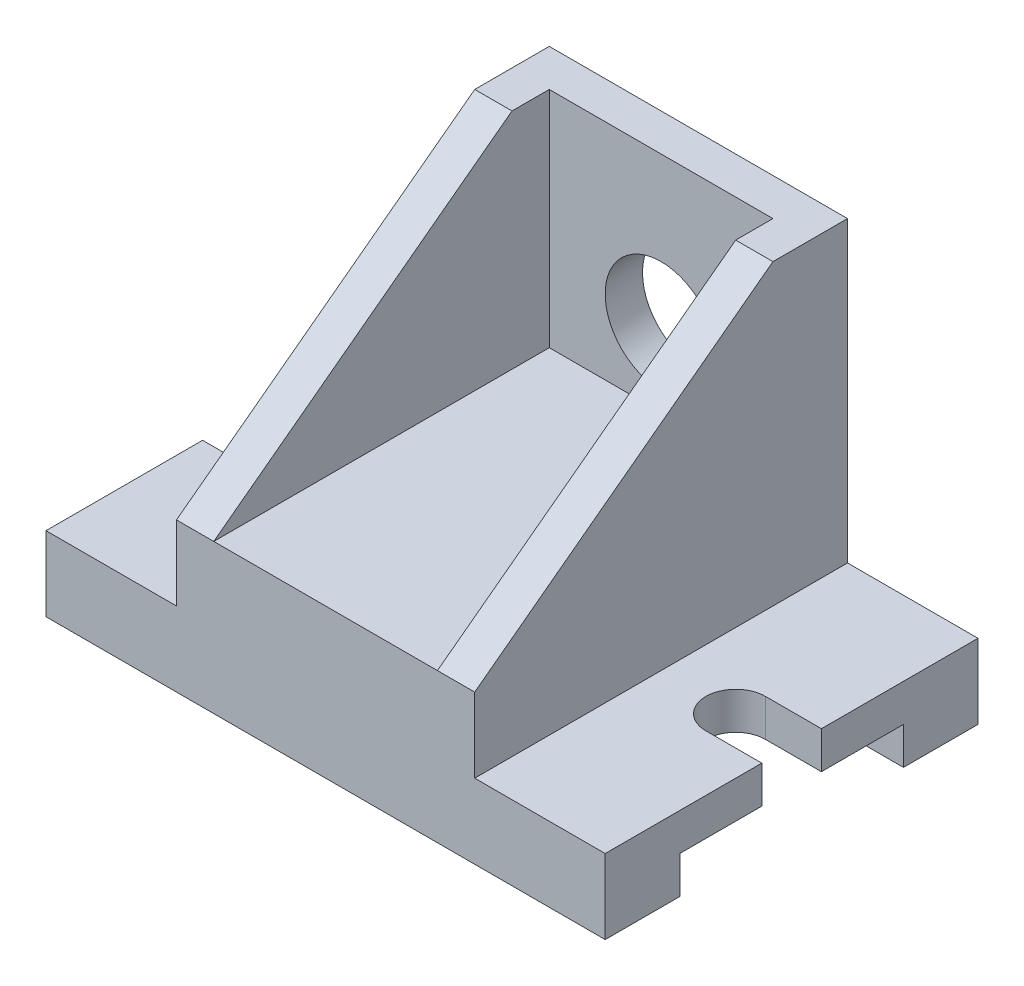
ISO-10303-21;
HEADER;
FILE_DESCRIPTION(('STEP AP214'),'2;1');
FILE_NAME('part.step','',(''),(''),'','','');
FILE_SCHEMA(('AUTOMOTIVE_DESIGN { 1 0 10303 214 1 1 1 1 }'));
ENDSEC;
DATA;
#1=APPLICATION_CONTEXT('core data for automotive mechanical design processes');
#2=APPLICATION_PROTOCOL_DEFINITION('international standard','automotive_design',2000,#1);
#3=PRODUCT_CONTEXT('',#1,'mechanical');
#4=PRODUCT('Part','Part','',(#3));
#5=PRODUCT_RELATED_PRODUCT_CATEGORY('part','',(#4));
#6=PRODUCT_DEFINITION_FORMATION('','',#4);
#7=PRODUCT_DEFINITION_CONTEXT('part definition',#1,'design');
#8=PRODUCT_DEFINITION('design','',#6,#7);
#9=PRODUCT_DEFINITION_SHAPE('','',#8);
#10=(LENGTH_UNIT() NAMED_UNIT(*) SI_UNIT(.MILLI.,.METRE.));
#11=(NAMED_UNIT(*) PLANE_ANGLE_UNIT() SI_UNIT($,.RADIAN.));
#12=(NAMED_UNIT(*) SI_UNIT($,.STERADIAN.) SOLID_ANGLE_UNIT());
#13=UNCERTAINTY_MEASURE_WITH_UNIT(LENGTH_MEASURE(1.E-05),#10,'distance_accuracy_value','');
#14=(GEOMETRIC_REPRESENTATION_CONTEXT(3) GLOBAL_UNCERTAINTY_ASSIGNED_CONTEXT((#13)) GLOBAL_UNIT_ASSIGNED_CONTEXT((#10,
#11,#12)) REPRESENTATION_CONTEXT('',''));
#15=CARTESIAN_POINT('',(0.,0.,0.));
#16=DIRECTION('',(0.,0.,1.));
#17=DIRECTION('',(1.,0.,0.));
#18=AXIS2_PLACEMENT_3D('',#15,#16,#17);
#19=CARTESIAN_POINT('',(75.,60.,-100.00005));
#20=DIRECTION('',(0.,0.,1.));
#21=DIRECTION('',(1.,0.,0.));
#22=AXIS2_PLACEMENT_3D('',#19,#20,#21);
#23=CYLINDRICAL_SURFACE('',#22,15.);
#24=CARTESIAN_POINT('',(75.,60.,-100.));
#25=DIRECTION('',(0.,0.,-1.));
#26=DIRECTION('',(-1.,0.,0.));
#27=AXIS2_PLACEMENT_3D('',#24,#25,#26);
#28=CIRCLE('',#27,15.);
#29=CARTESIAN_POINT('',(60.,60.,-100.));
#30=VERTEX_POINT('',#29);
#31=EDGE_CURVE('E234',#30,#30,#28,.T.);
#32=ORIENTED_EDGE('',*,*,#31,.T.);
#33=EDGE_LOOP('',(#32));
#34=FACE_BOUND('',#33,.T.);
#35=CARTESIAN_POINT('',(75.,60.,-90.));
#36=DIRECTION('',(0.,0.,1.));
#37=DIRECTION('',(1.,0.,0.));
#38=AXIS2_PLACEMENT_3D('',#35,#36,#37);
#39=CIRCLE('',#38,15.);
#40=CARTESIAN_POINT('',(90.,60.,-90.));
#41=VERTEX_POINT('',#40);
#42=EDGE_CURVE('E37',#41,#41,#39,.F.);
#43=ORIENTED_EDGE('',*,*,#42,.F.);
#44=EDGE_LOOP('',(#43));
#45=FACE_BOUND('',#44,.T.);
#46=ADVANCED_FACE('F33',(#34,#45),#23,.F.);
#47=CARTESIAN_POINT('',(135.,20.,-50.));
#48=DIRECTION('',(0.,1.,0.));
#49=DIRECTION('',(0.,0.,1.));
#50=AXIS2_PLACEMENT_3D('',#47,#48,#49);
#51=PLANE('',#50);
#52=DIRECTION('',(1.,0.,0.));
#53=VECTOR('',#52,1.);
#54=CARTESIAN_POINT('',(0.,20.,-100.));
#55=LINE('',#54,#53);
#56=CARTESIAN_POINT('',(115.,20.,-100.));
#57=VERTEX_POINT('',#56);
#58=CARTESIAN_POINT('',(150.,20.,-100.));
#59=VERTEX_POINT('',#58);
#60=EDGE_CURVE('E296',#57,#59,#55,.T.);
#61=ORIENTED_EDGE('',*,*,#60,.F.);
#62=DIRECTION('',(0.,0.,1.));
#63=VECTOR('',#62,1.);
#64=CARTESIAN_POINT('',(115.,20.,-100.));
#65=LINE('',#64,#63);
#66=CARTESIAN_POINT('',(115.,20.,0.));
#67=VERTEX_POINT('',#66);
#68=EDGE_CURVE('E263',#57,#67,#65,.T.);
#69=ORIENTED_EDGE('',*,*,#68,.T.);
#70=DIRECTION('',(1.,0.,0.));
#71=VECTOR('',#70,1.);
#72=CARTESIAN_POINT('',(0.,20.,0.));
#73=LINE('',#72,#71);
#74=CARTESIAN_POINT('',(150.,20.,0.));
#75=VERTEX_POINT('',#74);
#76=EDGE_CURVE('E348',#67,#75,#73,.T.);
#77=ORIENTED_EDGE('',*,*,#76,.T.);
#78=DIRECTION('',(0.,0.,-1.));
#79=VECTOR('',#78,1.);
#80=CARTESIAN_POINT('',(150.,20.,0.));
#81=LINE('',#80,#79);
#82=CARTESIAN_POINT('',(150.,20.,-42.));
#83=VERTEX_POINT('',#82);
#84=EDGE_CURVE('E362',#75,#83,#81,.T.);
#85=ORIENTED_EDGE('',*,*,#84,.T.);
#86=DIRECTION('',(-1.,0.,0.));
#87=VECTOR('',#86,1.);
#88=CARTESIAN_POINT('',(150.,20.,-42.));
#89=LINE('',#88,#87);
#90=CARTESIAN_POINT('',(135.,20.,-42.));
#91=VERTEX_POINT('',#90);
#92=EDGE_CURVE('E360',#83,#91,#89,.T.);
#93=ORIENTED_EDGE('',*,*,#92,.T.);
#94=CARTESIAN_POINT('',(135.,20.,-50.));
#95=DIRECTION('',(0.,1.,0.));
#96=DIRECTION('',(0.,0.,1.));
#97=AXIS2_PLACEMENT_3D('',#94,#95,#96);
#98=CIRCLE('',#97,8.);
#99=CARTESIAN_POINT('',(135.,20.,-58.));
#100=VERTEX_POINT('',#99);
#101=EDGE_CURVE('E357',#100,#91,#98,.T.);
#102=ORIENTED_EDGE('',*,*,#101,.F.);
#103=DIRECTION('',(1.,0.,0.));
#104=VECTOR('',#103,1.);
#105=CARTESIAN_POINT('',(135.,20.,-58.));
#106=LINE('',#105,#104);
#107=CARTESIAN_POINT('',(150.,20.,-58.));
#108=VERTEX_POINT('',#107);
#109=EDGE_CURVE('E344',#100,#108,#106,.T.);
#110=ORIENTED_EDGE('',*,*,#109,.T.);
#111=DIRECTION('',(0.,0.,-1.));
#112=VECTOR('',#111,1.);
#113=CARTESIAN_POINT('',(150.,20.,-58.));
#114=LINE('',#113,#112);
#115=EDGE_CURVE('E342',#108,#59,#114,.T.);
#116=ORIENTED_EDGE('',*,*,#115,.T.);
#117=EDGE_LOOP('',(#61,#69,#77,#85,#93,#102,#110,#116));
#118=FACE_BOUND('',#117,.T.);
#119=ADVANCED_FACE('F473',(#118),#51,.T.);
#120=CARTESIAN_POINT('',(135.,0.,-50.));
#121=DIRECTION('',(0.,1.,0.));
#122=DIRECTION('',(0.,0.,1.));
#123=AXIS2_PLACEMENT_3D('',#120,#121,#122);
#124=PLANE('',#123);
#125=DIRECTION('',(0.,0.,-1.));
#126=VECTOR('',#125,1.);
#127=CARTESIAN_POINT('',(0.,0.,0.));
#128=LINE('',#127,#126);
#129=CARTESIAN_POINT('',(0.,0.,0.));
#130=VERTEX_POINT('',#129);
#131=CARTESIAN_POINT('',(0.,0.,-20.));
#132=VERTEX_POINT('',#131);
#133=EDGE_CURVE('E402',#130,#132,#128,.T.);
#134=ORIENTED_EDGE('',*,*,#133,.T.);
#135=DIRECTION('',(1.,0.,0.));
#136=VECTOR('',#135,1.);
#137=CARTESIAN_POINT('',(0.,0.,-20.));
#138=LINE('',#137,#136);
#139=CARTESIAN_POINT('',(150.,0.,-20.));
#140=VERTEX_POINT('',#139);
#141=EDGE_CURVE('E459',#132,#140,#138,.T.);
#142=ORIENTED_EDGE('',*,*,#141,.T.);
#143=DIRECTION('',(0.,0.,-1.));
#144=VECTOR('',#143,1.);
#145=CARTESIAN_POINT('',(150.,0.,0.));
#146=LINE('',#145,#144);
#147=CARTESIAN_POINT('',(150.,0.,0.));
#148=VERTEX_POINT('',#147);
#149=EDGE_CURVE('E407',#148,#140,#146,.T.);
#150=ORIENTED_EDGE('',*,*,#149,.F.);
#151=DIRECTION('',(1.,0.,0.));
#152=VECTOR('',#151,1.);
#153=CARTESIAN_POINT('',(0.,0.,0.));
#154=LINE('',#153,#152);
#155=EDGE_CURVE('E405',#130,#148,#154,.T.);
#156=ORIENTED_EDGE('',*,*,#155,.F.);
#157=EDGE_LOOP('',(#134,#142,#150,#156));
#158=FACE_BOUND('',#157,.T.);
#159=ADVANCED_FACE('F470',(#158),#124,.F.);
#160=CARTESIAN_POINT('',(0.,20.,-58.));
#161=DIRECTION('',(-1.,0.,0.));
#162=DIRECTION('',(0.,0.,1.));
#163=AXIS2_PLACEMENT_3D('',#160,#161,#162);
#164=PLANE('',#163);
#165=DIRECTION('',(0.,0.,1.));
#166=VECTOR('',#165,1.);
#167=CARTESIAN_POINT('',(0.,10.,-20.));
#168=LINE('',#167,#166);
#169=CARTESIAN_POINT('',(0.,10.,-80.));
#170=VERTEX_POINT('',#169);
#171=CARTESIAN_POINT('',(0.,10.,-58.));
#172=VERTEX_POINT('',#171);
#173=EDGE_CURVE('E453',#170,#172,#168,.T.);
#174=ORIENTED_EDGE('',*,*,#173,.T.);
#175=DIRECTION('',(0.,-1.,0.));
#176=VECTOR('',#175,1.);
#177=CARTESIAN_POINT('',(0.,20.,-58.));
#178=LINE('',#177,#176);
#179=CARTESIAN_POINT('',(0.,20.,-58.));
#180=VERTEX_POINT('',#179);
#181=EDGE_CURVE('E275',#180,#172,#178,.T.);
#182=ORIENTED_EDGE('',*,*,#181,.F.);
#183=DIRECTION('',(0.,0.,-1.));
#184=VECTOR('',#183,1.);
#185=CARTESIAN_POINT('',(0.,20.,-58.));
#186=LINE('',#185,#184);
#187=CARTESIAN_POINT('',(0.,20.,-100.));
#188=VERTEX_POINT('',#187);
#189=EDGE_CURVE('E346',#180,#188,#186,.T.);
#190=ORIENTED_EDGE('',*,*,#189,.T.);
#191=DIRECTION('',(0.,-1.,0.));
#192=VECTOR('',#191,1.);
#193=CARTESIAN_POINT('',(0.,20.,-100.));
#194=LINE('',#193,#192);
#195=CARTESIAN_POINT('',(0.,0.,-100.));
#196=VERTEX_POINT('',#195);
#197=EDGE_CURVE('E341',#188,#196,#194,.T.);
#198=ORIENTED_EDGE('',*,*,#197,.T.);
#199=DIRECTION('',(0.,0.,-1.));
#200=VECTOR('',#199,1.);
#201=CARTESIAN_POINT('',(0.,0.,-58.));
#202=LINE('',#201,#200);
#203=CARTESIAN_POINT('',(0.,0.,-80.));
#204=VERTEX_POINT('',#203);
#205=EDGE_CURVE('E415',#204,#196,#202,.T.);
#206=ORIENTED_EDGE('',*,*,#205,.F.);
#207=DIRECTION('',(0.,1.,0.));
#208=VECTOR('',#207,1.);
#209=CARTESIAN_POINT('',(0.,0.,-80.));
#210=LINE('',#209,#208);
#211=EDGE_CURVE('E458',#204,#170,#210,.T.);
#212=ORIENTED_EDGE('',*,*,#211,.T.);
#213=EDGE_LOOP('',(#174,#182,#190,#198,#206,#212));
#214=FACE_BOUND('',#213,.T.);
#215=ADVANCED_FACE('F35',(#214),#164,.T.);
#216=CARTESIAN_POINT('',(15.,20.,-58.));
#217=DIRECTION('',(0.,0.,1.));
#218=DIRECTION('',(1.,0.,0.));
#219=AXIS2_PLACEMENT_3D('',#216,#217,#218);
#220=PLANE('',#219);
#221=DIRECTION('',(-1.,0.,0.));
#222=VECTOR('',#221,1.);
#223=CARTESIAN_POINT('',(15.,10.,-58.));
#224=LINE('',#223,#222);
#225=CARTESIAN_POINT('',(15.,10.,-58.));
#226=VERTEX_POINT('',#225);
#227=EDGE_CURVE('E417',#226,#172,#224,.T.);
#228=ORIENTED_EDGE('',*,*,#227,.F.);
#229=DIRECTION('',(0.,-1.,0.));
#230=VECTOR('',#229,1.);
#231=CARTESIAN_POINT('',(15.,20.,-58.));
#232=LINE('',#231,#230);
#233=CARTESIAN_POINT('',(15.,20.,-58.));
#234=VERTEX_POINT('',#233);
#235=EDGE_CURVE('E397',#234,#226,#232,.T.);
#236=ORIENTED_EDGE('',*,*,#235,.F.);
#237=DIRECTION('',(-1.,0.,0.));
#238=VECTOR('',#237,1.);
#239=CARTESIAN_POINT('',(15.,20.,-58.));
#240=LINE('',#239,#238);
#241=EDGE_CURVE('E371',#234,#180,#240,.T.);
#242=ORIENTED_EDGE('',*,*,#241,.T.);
#243=ORIENTED_EDGE('',*,*,#181,.T.);
#244=EDGE_LOOP('',(#228,#236,#242,#243));
#245=FACE_BOUND('',#244,.T.);
#246=ADVANCED_FACE('F462',(#245),#220,.T.);
#247=CARTESIAN_POINT('',(15.,20.,-50.));
#248=DIRECTION('',(0.,-1.,0.));
#249=DIRECTION('',(0.,0.,-1.));
#250=AXIS2_PLACEMENT_3D('',#247,#248,#249);
#251=CYLINDRICAL_SURFACE('',#250,8.);
#252=CARTESIAN_POINT('',(15.,10.,-50.));
#253=DIRECTION('',(0.,1.,0.));
#254=DIRECTION('',(0.,0.,1.));
#255=AXIS2_PLACEMENT_3D('',#252,#253,#254);
#256=CIRCLE('',#255,8.);
#257=CARTESIAN_POINT('',(15.,10.,-42.));
#258=VERTEX_POINT('',#257);
#259=EDGE_CURVE('E437',#258,#226,#256,.T.);
#260=ORIENTED_EDGE('',*,*,#259,.F.);
#261=DIRECTION('',(0.,-1.,0.));
#262=VECTOR('',#261,1.);
#263=CARTESIAN_POINT('',(15.,20.,-42.));
#264=LINE('',#263,#262);
#265=CARTESIAN_POINT('',(15.,20.,-42.));
#266=VERTEX_POINT('',#265);
#267=EDGE_CURVE('E394',#266,#258,#264,.T.);
#268=ORIENTED_EDGE('',*,*,#267,.F.);
#269=CARTESIAN_POINT('',(15.,20.,-50.));
#270=DIRECTION('',(0.,1.,0.));
#271=DIRECTION('',(0.,0.,1.));
#272=AXIS2_PLACEMENT_3D('',#269,#270,#271);
#273=CIRCLE('',#272,8.);
#274=EDGE_CURVE('E420',#266,#234,#273,.T.);
#275=ORIENTED_EDGE('',*,*,#274,.T.);
#276=ORIENTED_EDGE('',*,*,#235,.T.);
#277=EDGE_LOOP('',(#260,#268,#275,#276));
#278=FACE_BOUND('',#277,.T.);
#279=ADVANCED_FACE('F436',(#278),#251,.F.);
#280=CARTESIAN_POINT('',(0.,20.,-42.));
#281=DIRECTION('',(0.,0.,-1.));
#282=DIRECTION('',(-1.,0.,0.));
#283=AXIS2_PLACEMENT_3D('',#280,#281,#282);
#284=PLANE('',#283);
#285=DIRECTION('',(1.,0.,0.));
#286=VECTOR('',#285,1.);
#287=CARTESIAN_POINT('',(0.,10.,-42.));
#288=LINE('',#287,#286);
#289=CARTESIAN_POINT('',(0.,10.,-42.));
#290=VERTEX_POINT('',#289);
#291=EDGE_CURVE('E440',#290,#258,#288,.T.);
#292=ORIENTED_EDGE('',*,*,#291,.F.);
#293=DIRECTION('',(0.,-1.,0.));
#294=VECTOR('',#293,1.);
#295=CARTESIAN_POINT('',(0.,20.,-42.));
#296=LINE('',#295,#294);
#297=CARTESIAN_POINT('',(0.,20.,-42.));
#298=VERTEX_POINT('',#297);
#299=EDGE_CURVE('E391',#298,#290,#296,.T.);
#300=ORIENTED_EDGE('',*,*,#299,.F.);
#301=DIRECTION('',(1.,0.,0.));
#302=VECTOR('',#301,1.);
#303=CARTESIAN_POINT('',(0.,20.,-42.));
#304=LINE('',#303,#302);
#305=EDGE_CURVE('E422',#298,#266,#304,.T.);
#306=ORIENTED_EDGE('',*,*,#305,.T.);
#307=ORIENTED_EDGE('',*,*,#267,.T.);
#308=EDGE_LOOP('',(#292,#300,#306,#307));
#309=FACE_BOUND('',#308,.T.);
#310=ADVANCED_FACE('F439',(#309),#284,.T.);
#311=CARTESIAN_POINT('',(0.,20.,0.));
#312=DIRECTION('',(-1.,0.,0.));
#313=DIRECTION('',(0.,0.,1.));
#314=AXIS2_PLACEMENT_3D('',#311,#312,#313);
#315=PLANE('',#314);
#316=DIRECTION('',(0.,-1.,0.));
#317=VECTOR('',#316,1.);
#318=CARTESIAN_POINT('',(0.,0.,-20.));
#319=LINE('',#318,#317);
#320=CARTESIAN_POINT('',(0.,10.,-20.));
#321=VERTEX_POINT('',#320);
#322=EDGE_CURVE('E291',#321,#132,#319,.T.);
#323=ORIENTED_EDGE('',*,*,#322,.T.);
#324=ORIENTED_EDGE('',*,*,#133,.F.);
#325=DIRECTION('',(0.,-1.,0.));
#326=VECTOR('',#325,1.);
#327=CARTESIAN_POINT('',(0.,20.,0.));
#328=LINE('',#327,#326);
#329=CARTESIAN_POINT('',(0.,20.,0.));
#330=VERTEX_POINT('',#329);
#331=EDGE_CURVE('E389',#330,#130,#328,.T.);
#332=ORIENTED_EDGE('',*,*,#331,.F.);
#333=DIRECTION('',(0.,0.,-1.));
#334=VECTOR('',#333,1.);
#335=CARTESIAN_POINT('',(0.,20.,0.));
#336=LINE('',#335,#334);
#337=EDGE_CURVE('E365',#330,#298,#336,.T.);
#338=ORIENTED_EDGE('',*,*,#337,.T.);
#339=ORIENTED_EDGE('',*,*,#299,.T.);
#340=EDGE_CURVE('E460',#290,#321,#168,.T.);
#341=ORIENTED_EDGE('',*,*,#340,.T.);
#342=EDGE_LOOP('',(#323,#324,#332,#338,#339,#341));
#343=FACE_BOUND('',#342,.T.);
#344=ADVANCED_FACE('F429',(#343),#315,.T.);
#345=CARTESIAN_POINT('',(0.,20.,0.));
#346=DIRECTION('',(0.,0.,-1.));
#347=DIRECTION('',(-1.,0.,0.));
#348=AXIS2_PLACEMENT_3D('',#345,#346,#347);
#349=PLANE('',#348);
#350=DIRECTION('',(0.,-1.,0.));
#351=VECTOR('',#350,1.);
#352=CARTESIAN_POINT('',(115.,40.,0.));
#353=LINE('',#352,#351);
#354=CARTESIAN_POINT('',(115.,40.,0.));
#355=VERTEX_POINT('',#354);
#356=EDGE_CURVE('E276',#355,#67,#353,.T.);
#357=ORIENTED_EDGE('',*,*,#356,.F.);
#358=DIRECTION('',(1.,0.,0.));
#359=VECTOR('',#358,1.);
#360=CARTESIAN_POINT('',(-2.49999999868411E-05,40.,0.));
#361=LINE('',#360,#359);
#362=CARTESIAN_POINT('',(105.,40.,0.));
#363=VERTEX_POINT('',#362);
#364=EDGE_CURVE('E237',#363,#355,#361,.T.);
#365=ORIENTED_EDGE('',*,*,#364,.F.);
#366=DIRECTION('',(1.,0.,0.));
#367=VECTOR('',#366,1.);
#368=CARTESIAN_POINT('',(35.,40.,0.));
#369=LINE('',#368,#367);
#370=CARTESIAN_POINT('',(45.,40.,0.));
#371=VERTEX_POINT('',#370);
#372=EDGE_CURVE('E270',#371,#363,#369,.T.);
#373=ORIENTED_EDGE('',*,*,#372,.F.);
#374=CARTESIAN_POINT('',(35.,40.,0.));
#375=VERTEX_POINT('',#374);
#376=EDGE_CURVE('E240',#375,#371,#361,.T.);
#377=ORIENTED_EDGE('',*,*,#376,.F.);
#378=DIRECTION('',(0.,-1.,0.));
#379=VECTOR('',#378,1.);
#380=CARTESIAN_POINT('',(35.,40.,0.));
#381=LINE('',#380,#379);
#382=CARTESIAN_POINT('',(35.,20.,0.));
#383=VERTEX_POINT('',#382);
#384=EDGE_CURVE('E277',#375,#383,#381,.T.);
#385=ORIENTED_EDGE('',*,*,#384,.T.);
#386=EDGE_CURVE('E337',#330,#383,#73,.T.);
#387=ORIENTED_EDGE('',*,*,#386,.F.);
#388=ORIENTED_EDGE('',*,*,#331,.T.);
#389=ORIENTED_EDGE('',*,*,#155,.T.);
#390=DIRECTION('',(0.,-1.,0.));
#391=VECTOR('',#390,1.);
#392=CARTESIAN_POINT('',(150.,20.,0.));
#393=LINE('',#392,#391);
#394=EDGE_CURVE('E386',#75,#148,#393,.T.);
#395=ORIENTED_EDGE('',*,*,#394,.F.);
#396=ORIENTED_EDGE('',*,*,#76,.F.);
#397=EDGE_LOOP('',(#357,#365,#373,#377,#385,#387,#388,#389,#395,#396));
#398=FACE_BOUND('',#397,.T.);
#399=ADVANCED_FACE('F323',(#398),#349,.F.);
#400=CARTESIAN_POINT('',(150.,20.,0.));
#401=DIRECTION('',(-1.,0.,0.));
#402=DIRECTION('',(0.,0.,1.));
#403=AXIS2_PLACEMENT_3D('',#400,#401,#402);
#404=PLANE('',#403);
#405=ORIENTED_EDGE('',*,*,#149,.T.);
#406=DIRECTION('',(0.,-1.,0.));
#407=VECTOR('',#406,1.);
#408=CARTESIAN_POINT('',(150.,0.,-20.));
#409=LINE('',#408,#407);
#410=CARTESIAN_POINT('',(150.,10.,-20.));
#411=VERTEX_POINT('',#410);
#412=EDGE_CURVE('E304',#411,#140,#409,.T.);
#413=ORIENTED_EDGE('',*,*,#412,.F.);
#414=DIRECTION('',(0.,0.,1.));
#415=VECTOR('',#414,1.);
#416=CARTESIAN_POINT('',(150.,10.,-20.));
#417=LINE('',#416,#415);
#418=CARTESIAN_POINT('',(150.,10.,-42.));
#419=VERTEX_POINT('',#418);
#420=EDGE_CURVE('E527',#419,#411,#417,.T.);
#421=ORIENTED_EDGE('',*,*,#420,.F.);
#422=DIRECTION('',(0.,-1.,0.));
#423=VECTOR('',#422,1.);
#424=CARTESIAN_POINT('',(150.,20.,-42.));
#425=LINE('',#424,#423);
#426=EDGE_CURVE('E383',#83,#419,#425,.T.);
#427=ORIENTED_EDGE('',*,*,#426,.F.);
#428=ORIENTED_EDGE('',*,*,#84,.F.);
#429=ORIENTED_EDGE('',*,*,#394,.T.);
#430=EDGE_LOOP('',(#405,#413,#421,#427,#428,#429));
#431=FACE_BOUND('',#430,.T.);
#432=ADVANCED_FACE('F559',(#431),#404,.F.);
#433=CARTESIAN_POINT('',(150.,20.,-42.));
#434=DIRECTION('',(0.,0.,1.));
#435=DIRECTION('',(1.,0.,0.));
#436=AXIS2_PLACEMENT_3D('',#433,#434,#435);
#437=PLANE('',#436);
#438=ORIENTED_EDGE('',*,*,#426,.T.);
#439=DIRECTION('',(-1.,0.,0.));
#440=VECTOR('',#439,1.);
#441=CARTESIAN_POINT('',(150.,10.,-42.));
#442=LINE('',#441,#440);
#443=CARTESIAN_POINT('',(135.,10.,-42.));
#444=VERTEX_POINT('',#443);
#445=EDGE_CURVE('E442',#419,#444,#442,.T.);
#446=ORIENTED_EDGE('',*,*,#445,.T.);
#447=DIRECTION('',(0.,-1.,0.));
#448=VECTOR('',#447,1.);
#449=CARTESIAN_POINT('',(135.,20.,-42.));
#450=LINE('',#449,#448);
#451=EDGE_CURVE('E380',#91,#444,#450,.T.);
#452=ORIENTED_EDGE('',*,*,#451,.F.);
#453=ORIENTED_EDGE('',*,*,#92,.F.);
#454=EDGE_LOOP('',(#438,#446,#452,#453));
#455=FACE_BOUND('',#454,.T.);
#456=ADVANCED_FACE('F548',(#455),#437,.F.);
#457=CARTESIAN_POINT('',(135.,20.,-50.));
#458=DIRECTION('',(0.,-1.,0.));
#459=DIRECTION('',(0.,0.,-1.));
#460=AXIS2_PLACEMENT_3D('',#457,#458,#459);
#461=CYLINDRICAL_SURFACE('',#460,8.);
#462=CARTESIAN_POINT('',(135.,10.,-50.));
#463=DIRECTION('',(0.,1.,0.));
#464=DIRECTION('',(0.,0.,1.));
#465=AXIS2_PLACEMENT_3D('',#462,#463,#464);
#466=CIRCLE('',#465,8.);
#467=CARTESIAN_POINT('',(135.,10.,-58.));
#468=VERTEX_POINT('',#467);
#469=EDGE_CURVE('E446',#468,#444,#466,.T.);
#470=ORIENTED_EDGE('',*,*,#469,.F.);
#471=DIRECTION('',(0.,-1.,0.));
#472=VECTOR('',#471,1.);
#473=CARTESIAN_POINT('',(135.,20.,-58.));
#474=LINE('',#473,#472);
#475=EDGE_CURVE('E377',#100,#468,#474,.T.);
#476=ORIENTED_EDGE('',*,*,#475,.F.);
#477=ORIENTED_EDGE('',*,*,#101,.T.);
#478=ORIENTED_EDGE('',*,*,#451,.T.);
#479=EDGE_LOOP('',(#470,#476,#477,#478));
#480=FACE_BOUND('',#479,.T.);
#481=ADVANCED_FACE('F551',(#480),#461,.F.);
#482=CARTESIAN_POINT('',(135.,20.,-58.));
#483=DIRECTION('',(0.,0.,-1.));
#484=DIRECTION('',(-1.,0.,0.));
#485=AXIS2_PLACEMENT_3D('',#482,#483,#484);
#486=PLANE('',#485);
#487=ORIENTED_EDGE('',*,*,#475,.T.);
#488=DIRECTION('',(1.,0.,0.));
#489=VECTOR('',#488,1.);
#490=CARTESIAN_POINT('',(135.,10.,-58.));
#491=LINE('',#490,#489);
#492=CARTESIAN_POINT('',(150.,10.,-58.));
#493=VERTEX_POINT('',#492);
#494=EDGE_CURVE('E537',#468,#493,#491,.T.);
#495=ORIENTED_EDGE('',*,*,#494,.T.);
#496=DIRECTION('',(0.,-1.,0.));
#497=VECTOR('',#496,1.);
#498=CARTESIAN_POINT('',(150.,20.,-58.));
#499=LINE('',#498,#497);
#500=EDGE_CURVE('E374',#108,#493,#499,.T.);
#501=ORIENTED_EDGE('',*,*,#500,.F.);
#502=ORIENTED_EDGE('',*,*,#109,.F.);
#503=EDGE_LOOP('',(#487,#495,#501,#502));
#504=FACE_BOUND('',#503,.T.);
#505=ADVANCED_FACE('F569',(#504),#486,.F.);
#506=CARTESIAN_POINT('',(150.,20.,-58.));
#507=DIRECTION('',(-1.,0.,0.));
#508=DIRECTION('',(0.,0.,1.));
#509=AXIS2_PLACEMENT_3D('',#506,#507,#508);
#510=PLANE('',#509);
#511=ORIENTED_EDGE('',*,*,#500,.T.);
#512=CARTESIAN_POINT('',(150.,10.,-80.));
#513=VERTEX_POINT('',#512);
#514=EDGE_CURVE('E526',#513,#493,#417,.T.);
#515=ORIENTED_EDGE('',*,*,#514,.F.);
#516=DIRECTION('',(0.,1.,0.));
#517=VECTOR('',#516,1.);
#518=CARTESIAN_POINT('',(150.,0.,-80.));
#519=LINE('',#518,#517);
#520=CARTESIAN_POINT('',(150.,0.,-80.));
#521=VERTEX_POINT('',#520);
#522=EDGE_CURVE('E531',#521,#513,#519,.T.);
#523=ORIENTED_EDGE('',*,*,#522,.F.);
#524=DIRECTION('',(0.,0.,-1.));
#525=VECTOR('',#524,1.);
#526=CARTESIAN_POINT('',(150.,0.,-58.));
#527=LINE('',#526,#525);
#528=CARTESIAN_POINT('',(150.,0.,-100.));
#529=VERTEX_POINT('',#528);
#530=EDGE_CURVE('E410',#521,#529,#527,.T.);
#531=ORIENTED_EDGE('',*,*,#530,.T.);
#532=DIRECTION('',(0.,-1.,0.));
#533=VECTOR('',#532,1.);
#534=CARTESIAN_POINT('',(150.,20.,-100.));
#535=LINE('',#534,#533);
#536=EDGE_CURVE('E370',#59,#529,#535,.T.);
#537=ORIENTED_EDGE('',*,*,#536,.F.);
#538=ORIENTED_EDGE('',*,*,#115,.F.);
#539=EDGE_LOOP('',(#511,#515,#523,#531,#537,#538));
#540=FACE_BOUND('',#539,.T.);
#541=ADVANCED_FACE('F565',(#540),#510,.F.);
#542=CARTESIAN_POINT('',(0.,20.,-100.));
#543=DIRECTION('',(0.,0.,-1.));
#544=DIRECTION('',(-1.,0.,0.));
#545=AXIS2_PLACEMENT_3D('',#542,#543,#544);
#546=PLANE('',#545);
#547=ORIENTED_EDGE('',*,*,#31,.F.);
#548=EDGE_LOOP('',(#547));
#549=FACE_BOUND('',#548,.T.);
#550=DIRECTION('',(1.,0.,0.));
#551=VECTOR('',#550,1.);
#552=CARTESIAN_POINT('',(0.,0.,-100.));
#553=LINE('',#552,#551);
#554=EDGE_CURVE('E412',#196,#529,#553,.T.);
#555=ORIENTED_EDGE('',*,*,#554,.F.);
#556=ORIENTED_EDGE('',*,*,#197,.F.);
#557=CARTESIAN_POINT('',(35.,20.,-100.));
#558=VERTEX_POINT('',#557);
#559=EDGE_CURVE('E334',#188,#558,#55,.T.);
#560=ORIENTED_EDGE('',*,*,#559,.T.);
#561=DIRECTION('',(0.,-1.,0.));
#562=VECTOR('',#561,1.);
#563=CARTESIAN_POINT('',(35.,40.,-100.));
#564=LINE('',#563,#562);
#565=CARTESIAN_POINT('',(35.,100.,-100.));
#566=VERTEX_POINT('',#565);
#567=EDGE_CURVE('E301',#566,#558,#564,.T.);
#568=ORIENTED_EDGE('',*,*,#567,.F.);
#569=DIRECTION('',(-1.,0.,0.));
#570=VECTOR('',#569,1.);
#571=CARTESIAN_POINT('',(0.,100.,-100.));
#572=LINE('',#571,#570);
#573=CARTESIAN_POINT('',(115.,100.,-100.));
#574=VERTEX_POINT('',#573);
#575=EDGE_CURVE('E257',#574,#566,#572,.T.);
#576=ORIENTED_EDGE('',*,*,#575,.F.);
#577=DIRECTION('',(0.,-1.,0.));
#578=VECTOR('',#577,1.);
#579=CARTESIAN_POINT('',(115.,40.,-100.));
#580=LINE('',#579,#578);
#581=EDGE_CURVE('E278',#574,#57,#580,.T.);
#582=ORIENTED_EDGE('',*,*,#581,.T.);
#583=ORIENTED_EDGE('',*,*,#60,.T.);
#584=ORIENTED_EDGE('',*,*,#536,.T.);
#585=EDGE_LOOP('',(#555,#556,#560,#568,#576,#582,#583,#584));
#586=FACE_BOUND('',#585,.T.);
#587=ADVANCED_FACE('F339',(#549,#586),#546,.T.);
#588=DIRECTION('',(0.,0.,1.));
#589=VECTOR('',#588,1.);
#590=CARTESIAN_POINT('',(35.,20.,-100.));
#591=LINE('',#590,#589);
#592=EDGE_CURVE('E284',#558,#383,#591,.T.);
#593=ORIENTED_EDGE('',*,*,#592,.F.);
#594=ORIENTED_EDGE('',*,*,#559,.F.);
#595=ORIENTED_EDGE('',*,*,#189,.F.);
#596=ORIENTED_EDGE('',*,*,#241,.F.);
#597=ORIENTED_EDGE('',*,*,#274,.F.);
#598=ORIENTED_EDGE('',*,*,#305,.F.);
#599=ORIENTED_EDGE('',*,*,#337,.F.);
#600=ORIENTED_EDGE('',*,*,#386,.T.);
#601=EDGE_LOOP('',(#593,#594,#595,#596,#597,#598,#599,#600));
#602=FACE_BOUND('',#601,.T.);
#603=ADVANCED_FACE('F332',(#602),#51,.T.);
#604=ORIENTED_EDGE('',*,*,#530,.F.);
#605=DIRECTION('',(1.,0.,0.));
#606=VECTOR('',#605,1.);
#607=CARTESIAN_POINT('',(0.,0.,-80.));
#608=LINE('',#607,#606);
#609=EDGE_CURVE('E540',#204,#521,#608,.T.);
#610=ORIENTED_EDGE('',*,*,#609,.F.);
#611=ORIENTED_EDGE('',*,*,#205,.T.);
#612=ORIENTED_EDGE('',*,*,#554,.T.);
#613=EDGE_LOOP('',(#604,#610,#611,#612));
#614=FACE_BOUND('',#613,.T.);
#615=ADVANCED_FACE('F505',(#614),#124,.F.);
#616=CARTESIAN_POINT('',(0.,10.,-20.));
#617=DIRECTION('',(0.,1.,0.));
#618=DIRECTION('',(0.,0.,1.));
#619=AXIS2_PLACEMENT_3D('',#616,#617,#618);
#620=PLANE('',#619);
#621=ORIENTED_EDGE('',*,*,#227,.T.);
#622=ORIENTED_EDGE('',*,*,#173,.F.);
#623=DIRECTION('',(1.,0.,0.));
#624=VECTOR('',#623,1.);
#625=CARTESIAN_POINT('',(0.,10.,-80.));
#626=LINE('',#625,#624);
#627=EDGE_CURVE('E538',#170,#513,#626,.T.);
#628=ORIENTED_EDGE('',*,*,#627,.T.);
#629=ORIENTED_EDGE('',*,*,#514,.T.);
#630=ORIENTED_EDGE('',*,*,#494,.F.);
#631=ORIENTED_EDGE('',*,*,#469,.T.);
#632=ORIENTED_EDGE('',*,*,#445,.F.);
#633=ORIENTED_EDGE('',*,*,#420,.T.);
#634=DIRECTION('',(1.,0.,0.));
#635=VECTOR('',#634,1.);
#636=CARTESIAN_POINT('',(0.,10.,-20.));
#637=LINE('',#636,#635);
#638=EDGE_CURVE('E535',#321,#411,#637,.T.);
#639=ORIENTED_EDGE('',*,*,#638,.F.);
#640=ORIENTED_EDGE('',*,*,#340,.F.);
#641=ORIENTED_EDGE('',*,*,#291,.T.);
#642=ORIENTED_EDGE('',*,*,#259,.T.);
#643=EDGE_LOOP('',(#621,#622,#628,#629,#630,#631,#632,#633,#639,#640,#641,#642));
#644=FACE_BOUND('',#643,.T.);
#645=ADVANCED_FACE('F452',(#644),#620,.F.);
#646=CARTESIAN_POINT('',(0.,0.,-20.));
#647=DIRECTION('',(0.,0.,1.));
#648=DIRECTION('',(1.,0.,0.));
#649=AXIS2_PLACEMENT_3D('',#646,#647,#648);
#650=PLANE('',#649);
#651=ORIENTED_EDGE('',*,*,#412,.T.);
#652=ORIENTED_EDGE('',*,*,#141,.F.);
#653=ORIENTED_EDGE('',*,*,#322,.F.);
#654=ORIENTED_EDGE('',*,*,#638,.T.);
#655=EDGE_LOOP('',(#651,#652,#653,#654));
#656=FACE_BOUND('',#655,.T.);
#657=ADVANCED_FACE('F504',(#656),#650,.F.);
#658=CARTESIAN_POINT('',(0.,0.,-80.));
#659=DIRECTION('',(0.,0.,-1.));
#660=DIRECTION('',(-1.,0.,0.));
#661=AXIS2_PLACEMENT_3D('',#658,#659,#660);
#662=PLANE('',#661);
#663=ORIENTED_EDGE('',*,*,#522,.T.);
#664=ORIENTED_EDGE('',*,*,#627,.F.);
#665=ORIENTED_EDGE('',*,*,#211,.F.);
#666=ORIENTED_EDGE('',*,*,#609,.T.);
#667=EDGE_LOOP('',(#663,#664,#665,#666));
#668=FACE_BOUND('',#667,.T.);
#669=ADVANCED_FACE('F498',(#668),#662,.F.);
#670=CARTESIAN_POINT('',(35.,40.,-100.));
#671=DIRECTION('',(1.,0.,0.));
#672=DIRECTION('',(0.,0.,-1.));
#673=AXIS2_PLACEMENT_3D('',#670,#671,#672);
#674=PLANE('',#673);
#675=ORIENTED_EDGE('',*,*,#384,.F.);
#676=DIRECTION('',(0.,0.6,-0.8));
#677=VECTOR('',#676,1.);
#678=CARTESIAN_POINT('',(35.,88.,-64.));
#679=LINE('',#678,#677);
#680=CARTESIAN_POINT('',(35.,100.,-80.));
#681=VERTEX_POINT('',#680);
#682=EDGE_CURVE('E253',#375,#681,#679,.T.);
#683=ORIENTED_EDGE('',*,*,#682,.T.);
#684=DIRECTION('',(0.,0.,1.));
#685=VECTOR('',#684,1.);
#686=CARTESIAN_POINT('',(35.,100.,0.));
#687=LINE('',#686,#685);
#688=EDGE_CURVE('E260',#566,#681,#687,.T.);
#689=ORIENTED_EDGE('',*,*,#688,.F.);
#690=ORIENTED_EDGE('',*,*,#567,.T.);
#691=ORIENTED_EDGE('',*,*,#592,.T.);
#692=EDGE_LOOP('',(#675,#683,#689,#690,#691));
#693=FACE_BOUND('',#692,.T.);
#694=ADVANCED_FACE('F327',(#693),#674,.F.);
#695=CARTESIAN_POINT('',(115.,40.,-100.));
#696=DIRECTION('',(1.,0.,0.));
#697=DIRECTION('',(0.,0.,-1.));
#698=AXIS2_PLACEMENT_3D('',#695,#696,#697);
#699=PLANE('',#698);
#700=DIRECTION('',(0.,0.6,-0.8));
#701=VECTOR('',#700,1.);
#702=CARTESIAN_POINT('',(115.,88.,-64.));
#703=LINE('',#702,#701);
#704=CARTESIAN_POINT('',(115.,100.,-80.));
#705=VERTEX_POINT('',#704);
#706=EDGE_CURVE('E57',#355,#705,#703,.T.);
#707=ORIENTED_EDGE('',*,*,#706,.F.);
#708=ORIENTED_EDGE('',*,*,#356,.T.);
#709=ORIENTED_EDGE('',*,*,#68,.F.);
#710=ORIENTED_EDGE('',*,*,#581,.F.);
#711=DIRECTION('',(0.,0.,-1.));
#712=VECTOR('',#711,1.);
#713=CARTESIAN_POINT('',(115.,100.,0.));
#714=LINE('',#713,#712);
#715=EDGE_CURVE('E214',#705,#574,#714,.T.);
#716=ORIENTED_EDGE('',*,*,#715,.F.);
#717=EDGE_LOOP('',(#707,#708,#709,#710,#716));
#718=FACE_BOUND('',#717,.T.);
#719=ADVANCED_FACE('F495',(#718),#699,.T.);
#720=CARTESIAN_POINT('',(0.,40.,0.));
#721=DIRECTION('',(0.,-1.,0.));
#722=DIRECTION('',(0.,0.,-1.));
#723=AXIS2_PLACEMENT_3D('',#720,#721,#722);
#724=PLANE('',#723);
#725=DIRECTION('',(0.,0.,1.));
#726=VECTOR('',#725,1.);
#727=CARTESIAN_POINT('',(105.,40.,0.));
#728=LINE('',#727,#726);
#729=CARTESIAN_POINT('',(105.,40.,-90.));
#730=VERTEX_POINT('',#729);
#731=EDGE_CURVE('E215',#730,#363,#728,.T.);
#732=ORIENTED_EDGE('',*,*,#731,.F.);
#733=DIRECTION('',(1.,0.,0.));
#734=VECTOR('',#733,1.);
#735=CARTESIAN_POINT('',(45.,40.,-90.));
#736=LINE('',#735,#734);
#737=CARTESIAN_POINT('',(45.,40.,-90.));
#738=VERTEX_POINT('',#737);
#739=EDGE_CURVE('E217',#738,#730,#736,.T.);
#740=ORIENTED_EDGE('',*,*,#739,.F.);
#741=DIRECTION('',(0.,0.,1.));
#742=VECTOR('',#741,1.);
#743=CARTESIAN_POINT('',(45.,40.,0.));
#744=LINE('',#743,#742);
#745=EDGE_CURVE('E204',#738,#371,#744,.T.);
#746=ORIENTED_EDGE('',*,*,#745,.T.);
#747=ORIENTED_EDGE('',*,*,#372,.T.);
#748=EDGE_LOOP('',(#732,#740,#746,#747));
#749=FACE_BOUND('',#748,.T.);
#750=ADVANCED_FACE('F218',(#749),#724,.F.);
#751=CARTESIAN_POINT('',(105.,100.,0.));
#752=DIRECTION('',(1.,0.,0.));
#753=DIRECTION('',(0.,0.,-1.));
#754=AXIS2_PLACEMENT_3D('',#751,#752,#753);
#755=PLANE('',#754);
#756=ORIENTED_EDGE('',*,*,#731,.T.);
#757=DIRECTION('',(0.,0.6,-0.8));
#758=VECTOR('',#757,1.);
#759=CARTESIAN_POINT('',(105.,61.6,-28.8));
#760=LINE('',#759,#758);
#761=CARTESIAN_POINT('',(105.,100.,-80.));
#762=VERTEX_POINT('',#761);
#763=EDGE_CURVE('E245',#363,#762,#760,.T.);
#764=ORIENTED_EDGE('',*,*,#763,.T.);
#765=DIRECTION('',(0.,0.,1.));
#766=VECTOR('',#765,1.);
#767=CARTESIAN_POINT('',(105.,100.,-90.));
#768=LINE('',#767,#766);
#769=CARTESIAN_POINT('',(105.,100.,-90.));
#770=VERTEX_POINT('',#769);
#771=EDGE_CURVE('E230',#770,#762,#768,.T.);
#772=ORIENTED_EDGE('',*,*,#771,.F.);
#773=DIRECTION('',(0.,1.,0.));
#774=VECTOR('',#773,1.);
#775=CARTESIAN_POINT('',(105.,100.,-90.));
#776=LINE('',#775,#774);
#777=EDGE_CURVE('E50',#730,#770,#776,.T.);
#778=ORIENTED_EDGE('',*,*,#777,.F.);
#779=EDGE_LOOP('',(#756,#764,#772,#778));
#780=FACE_BOUND('',#779,.T.);
#781=ADVANCED_FACE('F315',(#780),#755,.F.);
#782=CARTESIAN_POINT('',(45.,100.,0.));
#783=DIRECTION('',(1.,0.,0.));
#784=DIRECTION('',(0.,0.,-1.));
#785=AXIS2_PLACEMENT_3D('',#782,#783,#784);
#786=PLANE('',#785);
#787=DIRECTION('',(0.,0.6,-0.8));
#788=VECTOR('',#787,1.);
#789=CARTESIAN_POINT('',(45.,61.6,-28.8));
#790=LINE('',#789,#788);
#791=CARTESIAN_POINT('',(45.,100.,-80.));
#792=VERTEX_POINT('',#791);
#793=EDGE_CURVE('E210',#371,#792,#790,.T.);
#794=ORIENTED_EDGE('',*,*,#793,.F.);
#795=ORIENTED_EDGE('',*,*,#745,.F.);
#796=DIRECTION('',(0.,-1.,0.));
#797=VECTOR('',#796,1.);
#798=CARTESIAN_POINT('',(45.,100.,-90.));
#799=LINE('',#798,#797);
#800=CARTESIAN_POINT('',(45.,100.,-90.));
#801=VERTEX_POINT('',#800);
#802=EDGE_CURVE('E208',#801,#738,#799,.T.);
#803=ORIENTED_EDGE('',*,*,#802,.F.);
#804=DIRECTION('',(0.,0.,1.));
#805=VECTOR('',#804,1.);
#806=CARTESIAN_POINT('',(45.,100.,-90.));
#807=LINE('',#806,#805);
#808=EDGE_CURVE('E231',#801,#792,#807,.T.);
#809=ORIENTED_EDGE('',*,*,#808,.T.);
#810=EDGE_LOOP('',(#794,#795,#803,#809));
#811=FACE_BOUND('',#810,.T.);
#812=ADVANCED_FACE('F206',(#811),#786,.T.);
#813=CARTESIAN_POINT('',(0.,100.,0.));
#814=DIRECTION('',(0.,1.,0.));
#815=DIRECTION('',(0.,0.,1.));
#816=AXIS2_PLACEMENT_3D('',#813,#814,#815);
#817=PLANE('',#816);
#818=ORIENTED_EDGE('',*,*,#808,.F.);
#819=DIRECTION('',(-1.,0.,0.));
#820=VECTOR('',#819,1.);
#821=CARTESIAN_POINT('',(45.,100.,-90.));
#822=LINE('',#821,#820);
#823=EDGE_CURVE('E224',#770,#801,#822,.T.);
#824=ORIENTED_EDGE('',*,*,#823,.F.);
#825=ORIENTED_EDGE('',*,*,#771,.T.);
#826=DIRECTION('',(-1.,0.,0.));
#827=VECTOR('',#826,1.);
#828=CARTESIAN_POINT('',(0.,100.,-80.));
#829=LINE('',#828,#827);
#830=EDGE_CURVE('E11',#705,#762,#829,.T.);
#831=ORIENTED_EDGE('',*,*,#830,.F.);
#832=ORIENTED_EDGE('',*,*,#715,.T.);
#833=ORIENTED_EDGE('',*,*,#575,.T.);
#834=ORIENTED_EDGE('',*,*,#688,.T.);
#835=EDGE_CURVE('E42',#792,#681,#829,.T.);
#836=ORIENTED_EDGE('',*,*,#835,.F.);
#837=EDGE_LOOP('',(#818,#824,#825,#831,#832,#833,#834,#836));
#838=FACE_BOUND('',#837,.T.);
#839=ADVANCED_FACE('F317',(#838),#817,.T.);
#840=CARTESIAN_POINT('',(-2.49999999868411E-05,40.,0.));
#841=DIRECTION('',(0.,-0.8,-0.6));
#842=DIRECTION('',(0.,0.6,-0.8));
#843=AXIS2_PLACEMENT_3D('',#840,#841,#842);
#844=PLANE('',#843);
#845=ORIENTED_EDGE('',*,*,#376,.T.);
#846=ORIENTED_EDGE('',*,*,#793,.T.);
#847=ORIENTED_EDGE('',*,*,#835,.T.);
#848=ORIENTED_EDGE('',*,*,#682,.F.);
#849=EDGE_LOOP('',(#845,#846,#847,#848));
#850=FACE_BOUND('',#849,.T.);
#851=ADVANCED_FACE('F320',(#850),#844,.F.);
#852=ORIENTED_EDGE('',*,*,#706,.T.);
#853=ORIENTED_EDGE('',*,*,#830,.T.);
#854=ORIENTED_EDGE('',*,*,#763,.F.);
#855=ORIENTED_EDGE('',*,*,#364,.T.);
#856=EDGE_LOOP('',(#852,#853,#854,#855));
#857=FACE_BOUND('',#856,.T.);
#858=ADVANCED_FACE('F486',(#857),#844,.F.);
#859=CARTESIAN_POINT('',(0.,0.,-90.));
#860=DIRECTION('',(0.,0.,1.));
#861=DIRECTION('',(1.,0.,0.));
#862=AXIS2_PLACEMENT_3D('',#859,#860,#861);
#863=PLANE('',#862);
#864=ORIENTED_EDGE('',*,*,#802,.T.);
#865=ORIENTED_EDGE('',*,*,#739,.T.);
#866=ORIENTED_EDGE('',*,*,#777,.T.);
#867=ORIENTED_EDGE('',*,*,#823,.T.);
#868=EDGE_LOOP('',(#864,#865,#866,#867));
#869=FACE_BOUND('',#868,.T.);
#870=ORIENTED_EDGE('',*,*,#42,.T.);
#871=EDGE_LOOP('',(#870));
#872=FACE_BOUND('',#871,.T.);
#873=ADVANCED_FACE('F221',(#869,#872),#863,.T.);
#874=CLOSED_SHELL('',(#46,#119,#159,#215,#246,#279,#310,#344,#399,#432,#456,#481,#505,#541,#587,
#603,#615,#645,#657,#669,#694,#719,#750,#781,#812,#839,#851,#858,#873));
#875=MANIFOLD_SOLID_BREP('B2',#874);
#876=ADVANCED_BREP_SHAPE_REPRESENTATION('',(#18,#875),#14);
#877=SHAPE_DEFINITION_REPRESENTATION(#9,#876);
ENDSEC;
END-ISO-10303-21;
